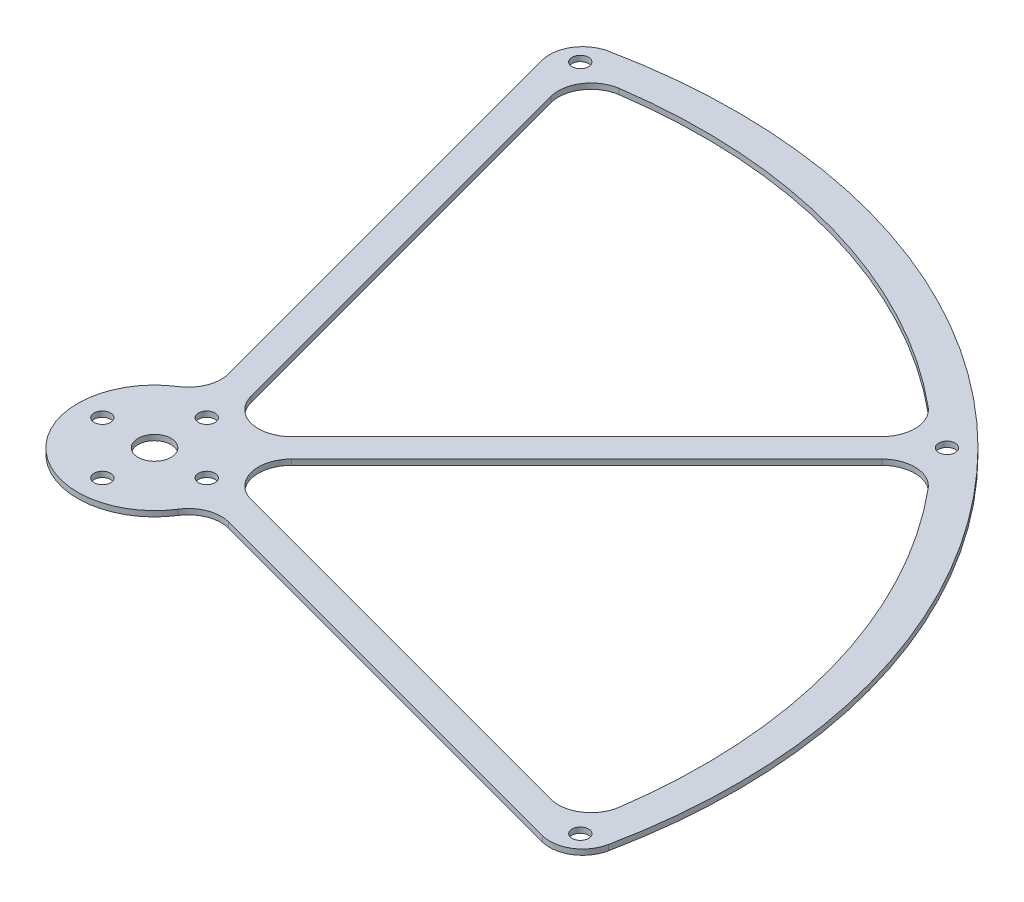
ISO-10303-21;
HEADER;
FILE_DESCRIPTION(('STEP AP214'),'2;1');
FILE_NAME('part.step','',(''),(''),'','','');
FILE_SCHEMA(('AUTOMOTIVE_DESIGN { 1 0 10303 214 1 1 1 1 }'));
ENDSEC;
DATA;
#1=APPLICATION_CONTEXT('core data for automotive mechanical design processes');
#2=APPLICATION_PROTOCOL_DEFINITION('international standard','automotive_design',2000,#1);
#3=PRODUCT_CONTEXT('',#1,'mechanical');
#4=PRODUCT('Part','Part','',(#3));
#5=PRODUCT_RELATED_PRODUCT_CATEGORY('part','',(#4));
#6=PRODUCT_DEFINITION_FORMATION('','',#4);
#7=PRODUCT_DEFINITION_CONTEXT('part definition',#1,'design');
#8=PRODUCT_DEFINITION('design','',#6,#7);
#9=PRODUCT_DEFINITION_SHAPE('','',#8);
#10=(LENGTH_UNIT() NAMED_UNIT(*) SI_UNIT(.MILLI.,.METRE.));
#11=(NAMED_UNIT(*) PLANE_ANGLE_UNIT() SI_UNIT($,.RADIAN.));
#12=(NAMED_UNIT(*) SI_UNIT($,.STERADIAN.) SOLID_ANGLE_UNIT());
#13=UNCERTAINTY_MEASURE_WITH_UNIT(LENGTH_MEASURE(1.E-05),#10,'distance_accuracy_value','');
#14=(GEOMETRIC_REPRESENTATION_CONTEXT(3) GLOBAL_UNCERTAINTY_ASSIGNED_CONTEXT((#13)) GLOBAL_UNIT_ASSIGNED_CONTEXT((#10,
#11,#12)) REPRESENTATION_CONTEXT('',''));
#15=CARTESIAN_POINT('',(0.,0.,0.));
#16=DIRECTION('',(0.,0.,1.));
#17=DIRECTION('',(1.,0.,0.));
#18=AXIS2_PLACEMENT_3D('',#15,#16,#17);
#19=CARTESIAN_POINT('',(-10.7335076216663,1.,-16.8757759565488));
#20=DIRECTION('',(0.,-1.,0.));
#21=DIRECTION('',(0.,0.,-1.));
#22=AXIS2_PLACEMENT_3D('',#19,#20,#21);
#23=PLANE('',#22);
#24=CARTESIAN_POINT('',(6.44116521906223,1.,-18.4619804992335));
#25=DIRECTION('',(0.,1.,0.));
#26=DIRECTION('',(0.,0.,-1.));
#27=AXIS2_PLACEMENT_3D('',#24,#25,#26);
#28=CIRCLE('',#27,6.);
#29=CARTESIAN_POINT('',(0.645610261327798,1.,-16.9090662286185));
#30=VERTEX_POINT('',#29);
#31=CARTESIAN_POINT('',(10.6838059061816,1.,-14.2193398121143));
#32=VERTEX_POINT('',#31);
#33=EDGE_CURVE('E260',#30,#32,#28,.T.);
#34=ORIENTED_EDGE('',*,*,#33,.F.);
#35=DIRECTION('',(0.258819045102518,0.,0.965925826289069));
#36=VECTOR('',#35,1.);
#37=CARTESIAN_POINT('',(0.645610261327798,1.,-16.9090662286185));
#38=LINE('',#37,#36);
#39=CARTESIAN_POINT('',(-19.3322065399041,1.,-91.46729355512));
#40=VERTEX_POINT('',#39);
#41=EDGE_CURVE('E277',#40,#30,#38,.T.);
#42=ORIENTED_EDGE('',*,*,#41,.F.);
#43=CARTESIAN_POINT('',(-13.5366515821697,1.,-93.0202078257351));
#44=DIRECTION('',(0.,1.,0.));
#45=DIRECTION('',(0.,0.,-1.));
#46=AXIS2_PLACEMENT_3D('',#43,#44,#45);
#47=CIRCLE('',#46,5.99999999999999);
#48=CARTESIAN_POINT('',(-14.4006931725209,1.,-98.9576678997181));
#49=VERTEX_POINT('',#48);
#50=EDGE_CURVE('E273',#49,#40,#47,.T.);
#51=ORIENTED_EDGE('',*,*,#50,.F.);
#52=CARTESIAN_POINT('',(0.,1.,0.));
#53=DIRECTION('',(0.,1.,0.));
#54=DIRECTION('',(0.,0.,1.));
#55=AXIS2_PLACEMENT_3D('',#52,#53,#54);
#56=CIRCLE('',#55,100.);
#57=CARTESIAN_POINT('',(64.0269413305991,1.,-76.8150426924832));
#58=VERTEX_POINT('',#57);
#59=EDGE_CURVE('E270',#58,#49,#56,.T.);
#60=ORIENTED_EDGE('',*,*,#59,.F.);
#61=CARTESIAN_POINT('',(60.1853248507631,1.,-72.2061401309342));
#62=DIRECTION('',(0.,1.,0.));
#63=DIRECTION('',(0.,0.,1.));
#64=AXIS2_PLACEMENT_3D('',#61,#62,#63);
#65=CIRCLE('',#64,6.00000000000001);
#66=CARTESIAN_POINT('',(64.4279655378824,1.,-67.9634994438149));
#67=VERTEX_POINT('',#66);
#68=EDGE_CURVE('E267',#67,#58,#65,.T.);
#69=ORIENTED_EDGE('',*,*,#68,.F.);
#70=DIRECTION('',(0.707106781186549,0.,-0.707106781186546));
#71=VECTOR('',#70,1.);
#72=CARTESIAN_POINT('',(64.4279655378824,1.,-67.9634994438149));
#73=LINE('',#72,#71);
#74=EDGE_CURVE('E263',#32,#67,#73,.T.);
#75=ORIENTED_EDGE('',*,*,#74,.F.);
#76=EDGE_LOOP('',(#34,#42,#51,#60,#69,#75));
#77=FACE_BOUND('',#76,.T.);
#78=CARTESIAN_POINT('',(-10.7335076216663,1.,-16.8757759565488));
#79=DIRECTION('',(0.,-1.,0.));
#80=DIRECTION('',(0.,0.,-1.));
#81=AXIS2_PLACEMENT_3D('',#78,#79,#80);
#82=CIRCLE('',#81,6.);
#83=CARTESIAN_POINT('',(-4.93795266393184,1.,-18.428690227164));
#84=VERTEX_POINT('',#83);
#85=CARTESIAN_POINT('',(-7.51345533516638,1.,-11.8130431695842));
#86=VERTEX_POINT('',#85);
#87=EDGE_CURVE('E363',#84,#86,#82,.T.);
#88=ORIENTED_EDGE('',*,*,#87,.T.);
#89=CARTESIAN_POINT('',(0.,1.,0.));
#90=DIRECTION('',(0.,1.,0.));
#91=DIRECTION('',(0.,0.,1.));
#92=AXIS2_PLACEMENT_3D('',#89,#90,#91);
#93=CIRCLE('',#92,14.);
#94=CARTESIAN_POINT('',(11.8130431695842,1.,7.51345533516642));
#95=VERTEX_POINT('',#94);
#96=EDGE_CURVE('E367',#86,#95,#93,.T.);
#97=ORIENTED_EDGE('',*,*,#96,.T.);
#98=CARTESIAN_POINT('',(16.8757759565488,1.,10.7335076216663));
#99=DIRECTION('',(0.,-1.,0.));
#100=DIRECTION('',(0.,0.,1.));
#101=AXIS2_PLACEMENT_3D('',#98,#99,#100);
#102=CIRCLE('',#101,6.);
#103=CARTESIAN_POINT('',(18.4286902271639,1.,4.93795266393191));
#104=VERTEX_POINT('',#103);
#105=EDGE_CURVE('E371',#95,#104,#102,.T.);
#106=ORIENTED_EDGE('',*,*,#105,.T.);
#107=DIRECTION('',(0.965925826289068,0.,0.258819045102521));
#108=VECTOR('',#107,1.);
#109=CARTESIAN_POINT('',(18.4286902271639,1.,4.93795266393191));
#110=LINE('',#109,#108);
#111=CARTESIAN_POINT('',(96.4185592178916,1.,25.8352750778065));
#112=VERTEX_POINT('',#111);
#113=EDGE_CURVE('E374',#104,#112,#110,.T.);
#114=ORIENTED_EDGE('',*,*,#113,.T.);
#115=CARTESIAN_POINT('',(97.9714734885067,1.,20.0397201200721));
#116=DIRECTION('',(0.,1.,0.));
#117=DIRECTION('',(0.,0.,-1.));
#118=AXIS2_PLACEMENT_3D('',#115,#116,#117);
#119=CIRCLE('',#118,6.);
#120=CARTESIAN_POINT('',(103.849761897817,1.,21.2421033272764));
#121=VERTEX_POINT('',#120);
#122=EDGE_CURVE('E377',#112,#121,#119,.T.);
#123=ORIENTED_EDGE('',*,*,#122,.T.);
#124=CARTESIAN_POINT('',(0.,1.,0.));
#125=DIRECTION('',(0.,1.,0.));
#126=DIRECTION('',(0.,0.,-1.));
#127=AXIS2_PLACEMENT_3D('',#124,#125,#126);
#128=CIRCLE('',#127,106.);
#129=CARTESIAN_POINT('',(-21.2421033272761,1.,-103.849761897817));
#130=VERTEX_POINT('',#129);
#131=EDGE_CURVE('E380',#121,#130,#128,.T.);
#132=ORIENTED_EDGE('',*,*,#131,.T.);
#133=CARTESIAN_POINT('',(-20.0397201200717,1.,-97.9714734885068));
#134=DIRECTION('',(0.,1.,0.));
#135=DIRECTION('',(0.,0.,1.));
#136=AXIS2_PLACEMENT_3D('',#133,#134,#135);
#137=CIRCLE('',#136,6.00000000000001);
#138=CARTESIAN_POINT('',(-25.8352750778062,1.,-96.4185592178917));
#139=VERTEX_POINT('',#138);
#140=EDGE_CURVE('E383',#130,#139,#137,.T.);
#141=ORIENTED_EDGE('',*,*,#140,.T.);
#142=DIRECTION('',(0.258819045102518,0.,0.965925826289069));
#143=VECTOR('',#142,1.);
#144=CARTESIAN_POINT('',(-25.8352750778062,1.,-96.4185592178917));
#145=LINE('',#144,#143);
#146=EDGE_CURVE('E386',#139,#84,#145,.T.);
#147=ORIENTED_EDGE('',*,*,#146,.T.);
#148=EDGE_LOOP('',(#88,#97,#106,#114,#123,#132,#141,#147));
#149=FACE_BOUND('',#148,.T.);
#150=CARTESIAN_POINT('',(0.,1.,-9.5));
#151=DIRECTION('',(0.,1.,0.));
#152=DIRECTION('',(0.,0.,1.));
#153=AXIS2_PLACEMENT_3D('',#150,#151,#152);
#154=CIRCLE('',#153,1.5);
#155=CARTESIAN_POINT('',(0.,1.,-8.));
#156=VERTEX_POINT('',#155);
#157=EDGE_CURVE('E355',#156,#156,#154,.T.);
#158=ORIENTED_EDGE('',*,*,#157,.F.);
#159=EDGE_LOOP('',(#158));
#160=FACE_BOUND('',#159,.T.);
#161=CARTESIAN_POINT('',(9.5,1.,0.));
#162=DIRECTION('',(0.,1.,0.));
#163=DIRECTION('',(0.,0.,1.));
#164=AXIS2_PLACEMENT_3D('',#161,#162,#163);
#165=CIRCLE('',#164,1.5);
#166=CARTESIAN_POINT('',(9.5,1.,1.5));
#167=VERTEX_POINT('',#166);
#168=EDGE_CURVE('E347',#167,#167,#165,.T.);
#169=ORIENTED_EDGE('',*,*,#168,.F.);
#170=EDGE_LOOP('',(#169));
#171=FACE_BOUND('',#170,.T.);
#172=CARTESIAN_POINT('',(0.,1.,9.5));
#173=DIRECTION('',(0.,1.,0.));
#174=DIRECTION('',(0.,0.,1.));
#175=AXIS2_PLACEMENT_3D('',#172,#173,#174);
#176=CIRCLE('',#175,1.5);
#177=CARTESIAN_POINT('',(0.,1.,11.));
#178=VERTEX_POINT('',#177);
#179=EDGE_CURVE('E339',#178,#178,#176,.T.);
#180=ORIENTED_EDGE('',*,*,#179,.F.);
#181=EDGE_LOOP('',(#180));
#182=FACE_BOUND('',#181,.T.);
#183=CARTESIAN_POINT('',(-9.5,1.,0.));
#184=DIRECTION('',(0.,1.,0.));
#185=DIRECTION('',(0.,0.,1.));
#186=AXIS2_PLACEMENT_3D('',#183,#184,#185);
#187=CIRCLE('',#186,1.5);
#188=CARTESIAN_POINT('',(-9.5,1.,1.5));
#189=VERTEX_POINT('',#188);
#190=EDGE_CURVE('E331',#189,#189,#187,.T.);
#191=ORIENTED_EDGE('',*,*,#190,.F.);
#192=EDGE_LOOP('',(#191));
#193=FACE_BOUND('',#192,.T.);
#194=CARTESIAN_POINT('',(0.,1.,0.));
#195=DIRECTION('',(0.,1.,0.));
#196=DIRECTION('',(0.,0.,1.));
#197=AXIS2_PLACEMENT_3D('',#194,#195,#196);
#198=CIRCLE('',#197,3.);
#199=CARTESIAN_POINT('',(0.,1.,3.));
#200=VERTEX_POINT('',#199);
#201=EDGE_CURVE('E323',#200,#200,#198,.T.);
#202=ORIENTED_EDGE('',*,*,#201,.F.);
#203=EDGE_LOOP('',(#202));
#204=FACE_BOUND('',#203,.T.);
#205=CARTESIAN_POINT('',(18.4619804992336,1.,-6.44116521906218));
#206=DIRECTION('',(0.,1.,0.));
#207=DIRECTION('',(0.,0.,1.));
#208=AXIS2_PLACEMENT_3D('',#205,#206,#207);
#209=CIRCLE('',#208,6.);
#210=CARTESIAN_POINT('',(14.2193398121143,1.,-10.6838059061815));
#211=VERTEX_POINT('',#210);
#212=CARTESIAN_POINT('',(16.9090662286185,1.,-0.645610261327742));
#213=VERTEX_POINT('',#212);
#214=EDGE_CURVE('E185',#211,#213,#209,.T.);
#215=ORIENTED_EDGE('',*,*,#214,.F.);
#216=DIRECTION('',(-0.707106781186548,0.,0.707106781186547));
#217=VECTOR('',#216,1.);
#218=CARTESIAN_POINT('',(67.9634994438151,1.,-64.4279655378822));
#219=LINE('',#218,#217);
#220=CARTESIAN_POINT('',(67.9634994438151,1.,-64.4279655378822));
#221=VERTEX_POINT('',#220);
#222=EDGE_CURVE('E225',#221,#211,#219,.T.);
#223=ORIENTED_EDGE('',*,*,#222,.F.);
#224=CARTESIAN_POINT('',(72.2061401309344,1.,-60.1853248507629));
#225=DIRECTION('',(0.,1.,0.));
#226=DIRECTION('',(0.,0.,-1.));
#227=AXIS2_PLACEMENT_3D('',#224,#225,#226);
#228=CIRCLE('',#227,6.00000000000002);
#229=CARTESIAN_POINT('',(76.8150426924834,1.,-64.0269413305988));
#230=VERTEX_POINT('',#229);
#231=EDGE_CURVE('E222',#230,#221,#228,.T.);
#232=ORIENTED_EDGE('',*,*,#231,.F.);
#233=CARTESIAN_POINT('',(0.,1.,0.));
#234=DIRECTION('',(0.,1.,0.));
#235=DIRECTION('',(0.,0.,-1.));
#236=AXIS2_PLACEMENT_3D('',#233,#234,#235);
#237=CIRCLE('',#236,100.);
#238=CARTESIAN_POINT('',(98.9576678997181,1.,14.4006931725213));
#239=VERTEX_POINT('',#238);
#240=EDGE_CURVE('E216',#239,#230,#237,.T.);
#241=ORIENTED_EDGE('',*,*,#240,.F.);
#242=CARTESIAN_POINT('',(93.020207825735,1.,13.53665158217));
#243=DIRECTION('',(0.,1.,0.));
#244=DIRECTION('',(0.,0.,-1.));
#245=AXIS2_PLACEMENT_3D('',#242,#243,#244);
#246=CIRCLE('',#245,6.);
#247=CARTESIAN_POINT('',(91.4672935551199,1.,19.3322065399044));
#248=VERTEX_POINT('',#247);
#249=EDGE_CURVE('E209',#248,#239,#246,.T.);
#250=ORIENTED_EDGE('',*,*,#249,.F.);
#251=DIRECTION('',(0.965925826289068,0.,0.258819045102521));
#252=VECTOR('',#251,1.);
#253=CARTESIAN_POINT('',(16.9090662286185,1.,-0.645610261327742));
#254=LINE('',#253,#252);
#255=EDGE_CURVE('E194',#213,#248,#254,.T.);
#256=ORIENTED_EDGE('',*,*,#255,.F.);
#257=EDGE_LOOP('',(#215,#223,#232,#241,#250,#256));
#258=FACE_BOUND('',#257,.T.);
#259=CARTESIAN_POINT('',(72.124891681028,1.,-72.1248916810277));
#260=DIRECTION('',(0.,1.,0.));
#261=DIRECTION('',(0.,0.,1.));
#262=AXIS2_PLACEMENT_3D('',#259,#260,#261);
#263=CIRCLE('',#262,1.5);
#264=CARTESIAN_POINT('',(72.124891681028,1.,-70.6248916810277));
#265=VERTEX_POINT('',#264);
#266=EDGE_CURVE('E230',#265,#265,#263,.T.);
#267=ORIENTED_EDGE('',*,*,#266,.F.);
#268=EDGE_LOOP('',(#267));
#269=FACE_BOUND('',#268,.T.);
#270=CARTESIAN_POINT('',(-22.0768406216924,1.,-99.5821927262321));
#271=DIRECTION('',(0.,1.,0.));
#272=DIRECTION('',(0.,0.,-1.));
#273=AXIS2_PLACEMENT_3D('',#270,#271,#272);
#274=CIRCLE('',#273,1.49999999999706);
#275=CARTESIAN_POINT('',(-22.0768406216924,1.,-101.082192726229));
#276=VERTEX_POINT('',#275);
#277=EDGE_CURVE('E607',#276,#276,#274,.T.);
#278=ORIENTED_EDGE('',*,*,#277,.F.);
#279=EDGE_LOOP('',(#278));
#280=FACE_BOUND('',#279,.T.);
#281=CARTESIAN_POINT('',(99.582192726232,1.,22.0768406216927));
#282=DIRECTION('',(0.,1.,0.));
#283=DIRECTION('',(0.,0.,1.));
#284=AXIS2_PLACEMENT_3D('',#281,#282,#283);
#285=CIRCLE('',#284,1.49999999999707);
#286=CARTESIAN_POINT('',(99.582192726232,1.,23.5768406216898));
#287=VERTEX_POINT('',#286);
#288=EDGE_CURVE('E595',#287,#287,#285,.T.);
#289=ORIENTED_EDGE('',*,*,#288,.F.);
#290=EDGE_LOOP('',(#289));
#291=FACE_BOUND('',#290,.T.);
#292=ADVANCED_FACE('F47',(#77,#149,#160,#171,#182,#193,#204,#258,#269,#280,#291),#23,.F.);
#293=CARTESIAN_POINT('',(-10.7335076216663,0.,-16.8757759565488));
#294=DIRECTION('',(0.,-1.,0.));
#295=DIRECTION('',(0.,0.,-1.));
#296=AXIS2_PLACEMENT_3D('',#293,#294,#295);
#297=PLANE('',#296);
#298=CARTESIAN_POINT('',(-22.0768406216924,0.,-99.5821927262321));
#299=DIRECTION('',(0.,1.,0.));
#300=DIRECTION('',(0.,0.,-1.));
#301=AXIS2_PLACEMENT_3D('',#298,#299,#300);
#302=CIRCLE('',#301,1.49999999999706);
#303=CARTESIAN_POINT('',(-22.0768406216924,0.,-101.082192726229));
#304=VERTEX_POINT('',#303);
#305=EDGE_CURVE('E604',#304,#304,#302,.T.);
#306=ORIENTED_EDGE('',*,*,#305,.T.);
#307=EDGE_LOOP('',(#306));
#308=FACE_BOUND('',#307,.T.);
#309=DIRECTION('',(-0.707106781186548,0.,0.707106781186547));
#310=VECTOR('',#309,1.);
#311=CARTESIAN_POINT('',(67.9634994438151,0.,-64.4279655378822));
#312=LINE('',#311,#310);
#313=CARTESIAN_POINT('',(67.9634994438151,0.,-64.4279655378822));
#314=VERTEX_POINT('',#313);
#315=CARTESIAN_POINT('',(14.2193398121144,0.,-10.6838059061815));
#316=VERTEX_POINT('',#315);
#317=EDGE_CURVE('E195',#314,#316,#312,.T.);
#318=ORIENTED_EDGE('',*,*,#317,.T.);
#319=CARTESIAN_POINT('',(18.4619804992336,0.,-6.44116521906218));
#320=DIRECTION('',(0.,1.,0.));
#321=DIRECTION('',(0.,0.,1.));
#322=AXIS2_PLACEMENT_3D('',#319,#320,#321);
#323=CIRCLE('',#322,6.);
#324=CARTESIAN_POINT('',(16.9090662286185,0.,-0.645610261327742));
#325=VERTEX_POINT('',#324);
#326=EDGE_CURVE('E71',#316,#325,#323,.T.);
#327=ORIENTED_EDGE('',*,*,#326,.T.);
#328=DIRECTION('',(0.965925826289068,0.,0.258819045102521));
#329=VECTOR('',#328,1.);
#330=CARTESIAN_POINT('',(16.9090662286185,0.,-0.645610261327742));
#331=LINE('',#330,#329);
#332=CARTESIAN_POINT('',(91.4672935551199,0.,19.3322065399044));
#333=VERTEX_POINT('',#332);
#334=EDGE_CURVE('E201',#325,#333,#331,.T.);
#335=ORIENTED_EDGE('',*,*,#334,.T.);
#336=CARTESIAN_POINT('',(93.020207825735,0.,13.53665158217));
#337=DIRECTION('',(0.,1.,0.));
#338=DIRECTION('',(0.,0.,-1.));
#339=AXIS2_PLACEMENT_3D('',#336,#337,#338);
#340=CIRCLE('',#339,6.);
#341=CARTESIAN_POINT('',(98.9576678997181,0.,14.4006931725213));
#342=VERTEX_POINT('',#341);
#343=EDGE_CURVE('E233',#333,#342,#340,.T.);
#344=ORIENTED_EDGE('',*,*,#343,.T.);
#345=CARTESIAN_POINT('',(0.,0.,0.));
#346=DIRECTION('',(0.,1.,0.));
#347=DIRECTION('',(0.,0.,-1.));
#348=AXIS2_PLACEMENT_3D('',#345,#346,#347);
#349=CIRCLE('',#348,100.);
#350=CARTESIAN_POINT('',(76.8150426924834,0.,-64.0269413305988));
#351=VERTEX_POINT('',#350);
#352=EDGE_CURVE('E237',#342,#351,#349,.T.);
#353=ORIENTED_EDGE('',*,*,#352,.T.);
#354=CARTESIAN_POINT('',(72.2061401309344,0.,-60.1853248507629));
#355=DIRECTION('',(0.,1.,0.));
#356=DIRECTION('',(0.,0.,-1.));
#357=AXIS2_PLACEMENT_3D('',#354,#355,#356);
#358=CIRCLE('',#357,6.00000000000002);
#359=EDGE_CURVE('E241',#351,#314,#358,.T.);
#360=ORIENTED_EDGE('',*,*,#359,.T.);
#361=EDGE_LOOP('',(#318,#327,#335,#344,#353,#360));
#362=FACE_BOUND('',#361,.T.);
#363=DIRECTION('',(0.258819045102518,0.,0.965925826289069));
#364=VECTOR('',#363,1.);
#365=CARTESIAN_POINT('',(0.645610261327798,0.,-16.9090662286185));
#366=LINE('',#365,#364);
#367=CARTESIAN_POINT('',(-19.3322065399041,0.,-91.46729355512));
#368=VERTEX_POINT('',#367);
#369=CARTESIAN_POINT('',(0.645610261327797,0.,-16.9090662286185));
#370=VERTEX_POINT('',#369);
#371=EDGE_CURVE('E264',#368,#370,#366,.T.);
#372=ORIENTED_EDGE('',*,*,#371,.T.);
#373=CARTESIAN_POINT('',(6.44116521906223,0.,-18.4619804992335));
#374=DIRECTION('',(0.,1.,0.));
#375=DIRECTION('',(0.,0.,-1.));
#376=AXIS2_PLACEMENT_3D('',#373,#374,#375);
#377=CIRCLE('',#376,6.);
#378=CARTESIAN_POINT('',(10.6838059061816,0.,-14.2193398121143));
#379=VERTEX_POINT('',#378);
#380=EDGE_CURVE('E203',#370,#379,#377,.T.);
#381=ORIENTED_EDGE('',*,*,#380,.T.);
#382=DIRECTION('',(0.707106781186549,0.,-0.707106781186546));
#383=VECTOR('',#382,1.);
#384=CARTESIAN_POINT('',(64.4279655378824,0.,-67.9634994438149));
#385=LINE('',#384,#383);
#386=CARTESIAN_POINT('',(64.4279655378824,0.,-67.9634994438149));
#387=VERTEX_POINT('',#386);
#388=EDGE_CURVE('E284',#379,#387,#385,.T.);
#389=ORIENTED_EDGE('',*,*,#388,.T.);
#390=CARTESIAN_POINT('',(60.1853248507631,0.,-72.2061401309342));
#391=DIRECTION('',(0.,1.,0.));
#392=DIRECTION('',(0.,0.,1.));
#393=AXIS2_PLACEMENT_3D('',#390,#391,#392);
#394=CIRCLE('',#393,6.00000000000001);
#395=CARTESIAN_POINT('',(64.0269413305991,0.,-76.8150426924832));
#396=VERTEX_POINT('',#395);
#397=EDGE_CURVE('E288',#387,#396,#394,.T.);
#398=ORIENTED_EDGE('',*,*,#397,.T.);
#399=CARTESIAN_POINT('',(0.,0.,0.));
#400=DIRECTION('',(0.,1.,0.));
#401=DIRECTION('',(0.,0.,1.));
#402=AXIS2_PLACEMENT_3D('',#399,#400,#401);
#403=CIRCLE('',#402,100.);
#404=CARTESIAN_POINT('',(-14.4006931725209,0.,-98.9576678997181));
#405=VERTEX_POINT('',#404);
#406=EDGE_CURVE('E292',#396,#405,#403,.T.);
#407=ORIENTED_EDGE('',*,*,#406,.T.);
#408=CARTESIAN_POINT('',(-13.5366515821697,0.,-93.0202078257351));
#409=DIRECTION('',(0.,1.,0.));
#410=DIRECTION('',(0.,0.,-1.));
#411=AXIS2_PLACEMENT_3D('',#408,#409,#410);
#412=CIRCLE('',#411,5.99999999999999);
#413=EDGE_CURVE('E296',#405,#368,#412,.T.);
#414=ORIENTED_EDGE('',*,*,#413,.T.);
#415=EDGE_LOOP('',(#372,#381,#389,#398,#407,#414));
#416=FACE_BOUND('',#415,.T.);
#417=CARTESIAN_POINT('',(0.,0.,0.));
#418=DIRECTION('',(0.,1.,0.));
#419=DIRECTION('',(0.,0.,1.));
#420=AXIS2_PLACEMENT_3D('',#417,#418,#419);
#421=CIRCLE('',#420,3.);
#422=CARTESIAN_POINT('',(0.,0.,3.));
#423=VERTEX_POINT('',#422);
#424=EDGE_CURVE('E322',#423,#423,#421,.T.);
#425=ORIENTED_EDGE('',*,*,#424,.T.);
#426=EDGE_LOOP('',(#425));
#427=FACE_BOUND('',#426,.T.);
#428=CARTESIAN_POINT('',(0.,0.,9.5));
#429=DIRECTION('',(0.,1.,0.));
#430=DIRECTION('',(0.,0.,1.));
#431=AXIS2_PLACEMENT_3D('',#428,#429,#430);
#432=CIRCLE('',#431,1.5);
#433=CARTESIAN_POINT('',(0.,0.,11.));
#434=VERTEX_POINT('',#433);
#435=EDGE_CURVE('E335',#434,#434,#432,.T.);
#436=ORIENTED_EDGE('',*,*,#435,.T.);
#437=EDGE_LOOP('',(#436));
#438=FACE_BOUND('',#437,.T.);
#439=CARTESIAN_POINT('',(0.,0.,-9.5));
#440=DIRECTION('',(0.,1.,0.));
#441=DIRECTION('',(0.,0.,1.));
#442=AXIS2_PLACEMENT_3D('',#439,#440,#441);
#443=CIRCLE('',#442,1.5);
#444=CARTESIAN_POINT('',(0.,0.,-8.));
#445=VERTEX_POINT('',#444);
#446=EDGE_CURVE('E351',#445,#445,#443,.T.);
#447=ORIENTED_EDGE('',*,*,#446,.T.);
#448=EDGE_LOOP('',(#447));
#449=FACE_BOUND('',#448,.T.);
#450=CARTESIAN_POINT('',(-10.7335076216663,0.,-16.8757759565488));
#451=DIRECTION('',(0.,-1.,0.));
#452=DIRECTION('',(0.,0.,-1.));
#453=AXIS2_PLACEMENT_3D('',#450,#451,#452);
#454=CIRCLE('',#453,6.);
#455=CARTESIAN_POINT('',(-4.93795266393184,0.,-18.428690227164));
#456=VERTEX_POINT('',#455);
#457=CARTESIAN_POINT('',(-7.51345533516638,0.,-11.8130431695842));
#458=VERTEX_POINT('',#457);
#459=EDGE_CURVE('E359',#456,#458,#454,.T.);
#460=ORIENTED_EDGE('',*,*,#459,.F.);
#461=DIRECTION('',(0.258819045102518,0.,0.965925826289069));
#462=VECTOR('',#461,1.);
#463=CARTESIAN_POINT('',(-25.8352750778062,0.,-96.4185592178917));
#464=LINE('',#463,#462);
#465=CARTESIAN_POINT('',(-25.8352750778062,0.,-96.4185592178917));
#466=VERTEX_POINT('',#465);
#467=EDGE_CURVE('E368',#466,#456,#464,.T.);
#468=ORIENTED_EDGE('',*,*,#467,.F.);
#469=CARTESIAN_POINT('',(-20.0397201200717,0.,-97.9714734885068));
#470=DIRECTION('',(0.,1.,0.));
#471=DIRECTION('',(0.,0.,1.));
#472=AXIS2_PLACEMENT_3D('',#469,#470,#471);
#473=CIRCLE('',#472,6.00000000000001);
#474=CARTESIAN_POINT('',(-21.2421033272761,0.,-103.849761897817));
#475=VERTEX_POINT('',#474);
#476=EDGE_CURVE('E408',#475,#466,#473,.T.);
#477=ORIENTED_EDGE('',*,*,#476,.F.);
#478=CARTESIAN_POINT('',(0.,0.,0.));
#479=DIRECTION('',(0.,1.,0.));
#480=DIRECTION('',(0.,0.,-1.));
#481=AXIS2_PLACEMENT_3D('',#478,#479,#480);
#482=CIRCLE('',#481,106.);
#483=CARTESIAN_POINT('',(103.849761897817,0.,21.2421033272764));
#484=VERTEX_POINT('',#483);
#485=EDGE_CURVE('E405',#484,#475,#482,.T.);
#486=ORIENTED_EDGE('',*,*,#485,.F.);
#487=CARTESIAN_POINT('',(97.9714734885067,0.,20.0397201200721));
#488=DIRECTION('',(0.,1.,0.));
#489=DIRECTION('',(0.,0.,-1.));
#490=AXIS2_PLACEMENT_3D('',#487,#488,#489);
#491=CIRCLE('',#490,6.);
#492=CARTESIAN_POINT('',(96.4185592178916,0.,25.8352750778065));
#493=VERTEX_POINT('',#492);
#494=EDGE_CURVE('E402',#493,#484,#491,.T.);
#495=ORIENTED_EDGE('',*,*,#494,.F.);
#496=DIRECTION('',(0.965925826289068,0.,0.258819045102521));
#497=VECTOR('',#496,1.);
#498=CARTESIAN_POINT('',(18.4286902271639,0.,4.93795266393191));
#499=LINE('',#498,#497);
#500=CARTESIAN_POINT('',(18.4286902271639,0.,4.93795266393191));
#501=VERTEX_POINT('',#500);
#502=EDGE_CURVE('E399',#501,#493,#499,.T.);
#503=ORIENTED_EDGE('',*,*,#502,.F.);
#504=CARTESIAN_POINT('',(16.8757759565488,0.,10.7335076216663));
#505=DIRECTION('',(0.,-1.,0.));
#506=DIRECTION('',(0.,0.,1.));
#507=AXIS2_PLACEMENT_3D('',#504,#505,#506);
#508=CIRCLE('',#507,6.);
#509=CARTESIAN_POINT('',(11.8130431695842,0.,7.51345533516642));
#510=VERTEX_POINT('',#509);
#511=EDGE_CURVE('E396',#510,#501,#508,.T.);
#512=ORIENTED_EDGE('',*,*,#511,.F.);
#513=CARTESIAN_POINT('',(0.,0.,0.));
#514=DIRECTION('',(0.,1.,0.));
#515=DIRECTION('',(0.,0.,1.));
#516=AXIS2_PLACEMENT_3D('',#513,#514,#515);
#517=CIRCLE('',#516,14.);
#518=EDGE_CURVE('E393',#458,#510,#517,.T.);
#519=ORIENTED_EDGE('',*,*,#518,.F.);
#520=EDGE_LOOP('',(#460,#468,#477,#486,#495,#503,#512,#519));
#521=FACE_BOUND('',#520,.T.);
#522=CARTESIAN_POINT('',(9.5,0.,0.));
#523=DIRECTION('',(0.,1.,0.));
#524=DIRECTION('',(0.,0.,1.));
#525=AXIS2_PLACEMENT_3D('',#522,#523,#524);
#526=CIRCLE('',#525,1.5);
#527=CARTESIAN_POINT('',(9.5,0.,1.5));
#528=VERTEX_POINT('',#527);
#529=EDGE_CURVE('E343',#528,#528,#526,.T.);
#530=ORIENTED_EDGE('',*,*,#529,.T.);
#531=EDGE_LOOP('',(#530));
#532=FACE_BOUND('',#531,.T.);
#533=CARTESIAN_POINT('',(-9.5,0.,0.));
#534=DIRECTION('',(0.,1.,0.));
#535=DIRECTION('',(0.,0.,1.));
#536=AXIS2_PLACEMENT_3D('',#533,#534,#535);
#537=CIRCLE('',#536,1.5);
#538=CARTESIAN_POINT('',(-9.5,0.,1.5));
#539=VERTEX_POINT('',#538);
#540=EDGE_CURVE('E327',#539,#539,#537,.T.);
#541=ORIENTED_EDGE('',*,*,#540,.T.);
#542=EDGE_LOOP('',(#541));
#543=FACE_BOUND('',#542,.T.);
#544=CARTESIAN_POINT('',(72.124891681028,0.,-72.1248916810277));
#545=DIRECTION('',(0.,1.,0.));
#546=DIRECTION('',(0.,0.,1.));
#547=AXIS2_PLACEMENT_3D('',#544,#545,#546);
#548=CIRCLE('',#547,1.5);
#549=CARTESIAN_POINT('',(72.124891681028,0.,-70.6248916810277));
#550=VERTEX_POINT('',#549);
#551=EDGE_CURVE('E611',#550,#550,#548,.T.);
#552=ORIENTED_EDGE('',*,*,#551,.T.);
#553=EDGE_LOOP('',(#552));
#554=FACE_BOUND('',#553,.T.);
#555=CARTESIAN_POINT('',(99.582192726232,0.,22.0768406216927));
#556=DIRECTION('',(0.,1.,0.));
#557=DIRECTION('',(0.,0.,1.));
#558=AXIS2_PLACEMENT_3D('',#555,#556,#557);
#559=CIRCLE('',#558,1.49999999999707);
#560=CARTESIAN_POINT('',(99.582192726232,0.,23.5768406216898));
#561=VERTEX_POINT('',#560);
#562=EDGE_CURVE('E598',#561,#561,#559,.T.);
#563=ORIENTED_EDGE('',*,*,#562,.T.);
#564=EDGE_LOOP('',(#563));
#565=FACE_BOUND('',#564,.T.);
#566=ADVANCED_FACE('F446',(#308,#362,#416,#427,#438,#449,#521,#532,#543,#554,#565),#297,.T.);
#567=CARTESIAN_POINT('',(-10.7335076216663,1.,-16.8757759565488));
#568=DIRECTION('',(0.,-1.,0.));
#569=DIRECTION('',(0.,0.,-1.));
#570=AXIS2_PLACEMENT_3D('',#567,#568,#569);
#571=CYLINDRICAL_SURFACE('',#570,6.);
#572=ORIENTED_EDGE('',*,*,#459,.T.);
#573=DIRECTION('',(0.,-1.,0.));
#574=VECTOR('',#573,1.);
#575=CARTESIAN_POINT('',(-7.51345533516638,1.,-11.8130431695842));
#576=LINE('',#575,#574);
#577=EDGE_CURVE('E11',#86,#458,#576,.T.);
#578=ORIENTED_EDGE('',*,*,#577,.F.);
#579=ORIENTED_EDGE('',*,*,#87,.F.);
#580=DIRECTION('',(0.,-1.,0.));
#581=VECTOR('',#580,1.);
#582=CARTESIAN_POINT('',(-4.93795266393184,1.,-18.428690227164));
#583=LINE('',#582,#581);
#584=EDGE_CURVE('E389',#84,#456,#583,.T.);
#585=ORIENTED_EDGE('',*,*,#584,.T.);
#586=EDGE_LOOP('',(#572,#578,#579,#585));
#587=FACE_BOUND('',#586,.T.);
#588=ADVANCED_FACE('F49',(#587),#571,.F.);
#589=CARTESIAN_POINT('',(0.,1.,0.));
#590=DIRECTION('',(0.,-1.,0.));
#591=DIRECTION('',(0.,0.,-1.));
#592=AXIS2_PLACEMENT_3D('',#589,#590,#591);
#593=CYLINDRICAL_SURFACE('',#592,14.);
#594=ORIENTED_EDGE('',*,*,#518,.T.);
#595=DIRECTION('',(0.,-1.,0.));
#596=VECTOR('',#595,1.);
#597=CARTESIAN_POINT('',(11.8130431695842,1.,7.51345533516642));
#598=LINE('',#597,#596);
#599=EDGE_CURVE('E56',#95,#510,#598,.T.);
#600=ORIENTED_EDGE('',*,*,#599,.F.);
#601=ORIENTED_EDGE('',*,*,#96,.F.);
#602=ORIENTED_EDGE('',*,*,#577,.T.);
#603=EDGE_LOOP('',(#594,#600,#601,#602));
#604=FACE_BOUND('',#603,.T.);
#605=ADVANCED_FACE('F464',(#604),#593,.T.);
#606=CARTESIAN_POINT('',(16.8757759565488,1.,10.7335076216663));
#607=DIRECTION('',(0.,-1.,0.));
#608=DIRECTION('',(0.,0.,-1.));
#609=AXIS2_PLACEMENT_3D('',#606,#607,#608);
#610=CYLINDRICAL_SURFACE('',#609,6.);
#611=ORIENTED_EDGE('',*,*,#511,.T.);
#612=DIRECTION('',(0.,-1.,0.));
#613=VECTOR('',#612,1.);
#614=CARTESIAN_POINT('',(18.4286902271639,1.,4.93795266393191));
#615=LINE('',#614,#613);
#616=EDGE_CURVE('E431',#104,#501,#615,.T.);
#617=ORIENTED_EDGE('',*,*,#616,.F.);
#618=ORIENTED_EDGE('',*,*,#105,.F.);
#619=ORIENTED_EDGE('',*,*,#599,.T.);
#620=EDGE_LOOP('',(#611,#617,#618,#619));
#621=FACE_BOUND('',#620,.T.);
#622=ADVANCED_FACE('F440',(#621),#610,.F.);
#623=CARTESIAN_POINT('',(18.4286902271639,1.,4.93795266393191));
#624=DIRECTION('',(0.258819045102521,0.,-0.965925826289068));
#625=DIRECTION('',(-0.965925826289068,0.,-0.258819045102521));
#626=AXIS2_PLACEMENT_3D('',#623,#624,#625);
#627=PLANE('',#626);
#628=ORIENTED_EDGE('',*,*,#502,.T.);
#629=DIRECTION('',(0.,-1.,0.));
#630=VECTOR('',#629,1.);
#631=CARTESIAN_POINT('',(96.4185592178916,1.,25.8352750778065));
#632=LINE('',#631,#630);
#633=EDGE_CURVE('E428',#112,#493,#632,.T.);
#634=ORIENTED_EDGE('',*,*,#633,.F.);
#635=ORIENTED_EDGE('',*,*,#113,.F.);
#636=ORIENTED_EDGE('',*,*,#616,.T.);
#637=EDGE_LOOP('',(#628,#634,#635,#636));
#638=FACE_BOUND('',#637,.T.);
#639=ADVANCED_FACE('F452',(#638),#627,.F.);
#640=CARTESIAN_POINT('',(97.9714734885067,1.,20.0397201200721));
#641=DIRECTION('',(0.,-1.,0.));
#642=DIRECTION('',(0.,0.,-1.));
#643=AXIS2_PLACEMENT_3D('',#640,#641,#642);
#644=CYLINDRICAL_SURFACE('',#643,6.);
#645=ORIENTED_EDGE('',*,*,#494,.T.);
#646=DIRECTION('',(0.,-1.,0.));
#647=VECTOR('',#646,1.);
#648=CARTESIAN_POINT('',(103.849761897817,1.,21.2421033272764));
#649=LINE('',#648,#647);
#650=EDGE_CURVE('E424',#121,#484,#649,.T.);
#651=ORIENTED_EDGE('',*,*,#650,.F.);
#652=ORIENTED_EDGE('',*,*,#122,.F.);
#653=ORIENTED_EDGE('',*,*,#633,.T.);
#654=EDGE_LOOP('',(#645,#651,#652,#653));
#655=FACE_BOUND('',#654,.T.);
#656=ADVANCED_FACE('F456',(#655),#644,.T.);
#657=CARTESIAN_POINT('',(0.,1.,0.));
#658=DIRECTION('',(0.,-1.,0.));
#659=DIRECTION('',(0.,0.,-1.));
#660=AXIS2_PLACEMENT_3D('',#657,#658,#659);
#661=CYLINDRICAL_SURFACE('',#660,106.);
#662=ORIENTED_EDGE('',*,*,#485,.T.);
#663=DIRECTION('',(0.,-1.,0.));
#664=VECTOR('',#663,1.);
#665=CARTESIAN_POINT('',(-21.2421033272761,1.,-103.849761897817));
#666=LINE('',#665,#664);
#667=EDGE_CURVE('E420',#130,#475,#666,.T.);
#668=ORIENTED_EDGE('',*,*,#667,.F.);
#669=ORIENTED_EDGE('',*,*,#131,.F.);
#670=ORIENTED_EDGE('',*,*,#650,.T.);
#671=EDGE_LOOP('',(#662,#668,#669,#670));
#672=FACE_BOUND('',#671,.T.);
#673=ADVANCED_FACE('F477',(#672),#661,.T.);
#674=CARTESIAN_POINT('',(-20.0397201200717,1.,-97.9714734885068));
#675=DIRECTION('',(0.,-1.,0.));
#676=DIRECTION('',(0.,0.,-1.));
#677=AXIS2_PLACEMENT_3D('',#674,#675,#676);
#678=CYLINDRICAL_SURFACE('',#677,6.00000000000001);
#679=ORIENTED_EDGE('',*,*,#476,.T.);
#680=DIRECTION('',(0.,-1.,0.));
#681=VECTOR('',#680,1.);
#682=CARTESIAN_POINT('',(-25.8352750778062,1.,-96.4185592178917));
#683=LINE('',#682,#681);
#684=EDGE_CURVE('E416',#139,#466,#683,.T.);
#685=ORIENTED_EDGE('',*,*,#684,.F.);
#686=ORIENTED_EDGE('',*,*,#140,.F.);
#687=ORIENTED_EDGE('',*,*,#667,.T.);
#688=EDGE_LOOP('',(#679,#685,#686,#687));
#689=FACE_BOUND('',#688,.T.);
#690=ADVANCED_FACE('F475',(#689),#678,.T.);
#691=CARTESIAN_POINT('',(-25.8352750778062,1.,-96.4185592178917));
#692=DIRECTION('',(0.965925826289069,0.,-0.258819045102518));
#693=DIRECTION('',(-0.258819045102518,0.,-0.965925826289069));
#694=AXIS2_PLACEMENT_3D('',#691,#692,#693);
#695=PLANE('',#694);
#696=ORIENTED_EDGE('',*,*,#467,.T.);
#697=ORIENTED_EDGE('',*,*,#584,.F.);
#698=ORIENTED_EDGE('',*,*,#146,.F.);
#699=ORIENTED_EDGE('',*,*,#684,.T.);
#700=EDGE_LOOP('',(#696,#697,#698,#699));
#701=FACE_BOUND('',#700,.T.);
#702=ADVANCED_FACE('F470',(#701),#695,.F.);
#703=CARTESIAN_POINT('',(0.,1.,-9.5));
#704=DIRECTION('',(0.,-1.,0.));
#705=DIRECTION('',(0.,0.,-1.));
#706=AXIS2_PLACEMENT_3D('',#703,#704,#705);
#707=CYLINDRICAL_SURFACE('',#706,1.5);
#708=ORIENTED_EDGE('',*,*,#157,.T.);
#709=EDGE_LOOP('',(#708));
#710=FACE_BOUND('',#709,.T.);
#711=ORIENTED_EDGE('',*,*,#446,.F.);
#712=EDGE_LOOP('',(#711));
#713=FACE_BOUND('',#712,.T.);
#714=ADVANCED_FACE('F494',(#710,#713),#707,.F.);
#715=CARTESIAN_POINT('',(9.5,1.,0.));
#716=DIRECTION('',(0.,-1.,0.));
#717=DIRECTION('',(0.,0.,-1.));
#718=AXIS2_PLACEMENT_3D('',#715,#716,#717);
#719=CYLINDRICAL_SURFACE('',#718,1.5);
#720=ORIENTED_EDGE('',*,*,#168,.T.);
#721=EDGE_LOOP('',(#720));
#722=FACE_BOUND('',#721,.T.);
#723=ORIENTED_EDGE('',*,*,#529,.F.);
#724=EDGE_LOOP('',(#723));
#725=FACE_BOUND('',#724,.T.);
#726=ADVANCED_FACE('F500',(#722,#725),#719,.F.);
#727=CARTESIAN_POINT('',(0.,1.,9.5));
#728=DIRECTION('',(0.,-1.,0.));
#729=DIRECTION('',(0.,0.,-1.));
#730=AXIS2_PLACEMENT_3D('',#727,#728,#729);
#731=CYLINDRICAL_SURFACE('',#730,1.5);
#732=ORIENTED_EDGE('',*,*,#179,.T.);
#733=EDGE_LOOP('',(#732));
#734=FACE_BOUND('',#733,.T.);
#735=ORIENTED_EDGE('',*,*,#435,.F.);
#736=EDGE_LOOP('',(#735));
#737=FACE_BOUND('',#736,.T.);
#738=ADVANCED_FACE('F504',(#734,#737),#731,.F.);
#739=CARTESIAN_POINT('',(-9.5,1.,0.));
#740=DIRECTION('',(0.,-1.,0.));
#741=DIRECTION('',(0.,0.,-1.));
#742=AXIS2_PLACEMENT_3D('',#739,#740,#741);
#743=CYLINDRICAL_SURFACE('',#742,1.5);
#744=ORIENTED_EDGE('',*,*,#190,.T.);
#745=EDGE_LOOP('',(#744));
#746=FACE_BOUND('',#745,.T.);
#747=ORIENTED_EDGE('',*,*,#540,.F.);
#748=EDGE_LOOP('',(#747));
#749=FACE_BOUND('',#748,.T.);
#750=ADVANCED_FACE('F523',(#746,#749),#743,.F.);
#751=CARTESIAN_POINT('',(0.,1.,0.));
#752=DIRECTION('',(0.,-1.,0.));
#753=DIRECTION('',(0.,0.,-1.));
#754=AXIS2_PLACEMENT_3D('',#751,#752,#753);
#755=CYLINDRICAL_SURFACE('',#754,3.);
#756=ORIENTED_EDGE('',*,*,#201,.T.);
#757=EDGE_LOOP('',(#756));
#758=FACE_BOUND('',#757,.T.);
#759=ORIENTED_EDGE('',*,*,#424,.F.);
#760=EDGE_LOOP('',(#759));
#761=FACE_BOUND('',#760,.T.);
#762=ADVANCED_FACE('F519',(#758,#761),#755,.F.);
#763=CARTESIAN_POINT('',(6.44116521906223,1.,-18.4619804992335));
#764=DIRECTION('',(0.,-1.,0.));
#765=DIRECTION('',(0.,0.,-1.));
#766=AXIS2_PLACEMENT_3D('',#763,#764,#765);
#767=CYLINDRICAL_SURFACE('',#766,6.);
#768=ORIENTED_EDGE('',*,*,#380,.F.);
#769=DIRECTION('',(0.,-1.,0.));
#770=VECTOR('',#769,1.);
#771=CARTESIAN_POINT('',(0.645610261327798,1.,-16.9090662286185));
#772=LINE('',#771,#770);
#773=EDGE_CURVE('E280',#30,#370,#772,.T.);
#774=ORIENTED_EDGE('',*,*,#773,.F.);
#775=ORIENTED_EDGE('',*,*,#33,.T.);
#776=DIRECTION('',(0.,-1.,0.));
#777=VECTOR('',#776,1.);
#778=CARTESIAN_POINT('',(10.6838059061816,1.,-14.2193398121143));
#779=LINE('',#778,#777);
#780=EDGE_CURVE('E318',#32,#379,#779,.T.);
#781=ORIENTED_EDGE('',*,*,#780,.T.);
#782=EDGE_LOOP('',(#768,#774,#775,#781));
#783=FACE_BOUND('',#782,.T.);
#784=ADVANCED_FACE('F522',(#783),#767,.F.);
#785=CARTESIAN_POINT('',(64.4279655378824,1.,-67.9634994438149));
#786=DIRECTION('',(-0.707106781186546,0.,-0.707106781186549));
#787=DIRECTION('',(-0.707106781186549,0.,0.707106781186546));
#788=AXIS2_PLACEMENT_3D('',#785,#786,#787);
#789=PLANE('',#788);
#790=ORIENTED_EDGE('',*,*,#388,.F.);
#791=ORIENTED_EDGE('',*,*,#780,.F.);
#792=ORIENTED_EDGE('',*,*,#74,.T.);
#793=DIRECTION('',(0.,-1.,0.));
#794=VECTOR('',#793,1.);
#795=CARTESIAN_POINT('',(64.4279655378824,1.,-67.9634994438149));
#796=LINE('',#795,#794);
#797=EDGE_CURVE('E315',#67,#387,#796,.T.);
#798=ORIENTED_EDGE('',*,*,#797,.T.);
#799=EDGE_LOOP('',(#790,#791,#792,#798));
#800=FACE_BOUND('',#799,.T.);
#801=ADVANCED_FACE('F540',(#800),#789,.T.);
#802=CARTESIAN_POINT('',(60.1853248507631,1.,-72.2061401309342));
#803=DIRECTION('',(0.,-1.,0.));
#804=DIRECTION('',(0.,0.,-1.));
#805=AXIS2_PLACEMENT_3D('',#802,#803,#804);
#806=CYLINDRICAL_SURFACE('',#805,6.00000000000001);
#807=ORIENTED_EDGE('',*,*,#397,.F.);
#808=ORIENTED_EDGE('',*,*,#797,.F.);
#809=ORIENTED_EDGE('',*,*,#68,.T.);
#810=DIRECTION('',(0.,-1.,0.));
#811=VECTOR('',#810,1.);
#812=CARTESIAN_POINT('',(64.0269413305991,1.,-76.8150426924832));
#813=LINE('',#812,#811);
#814=EDGE_CURVE('E312',#58,#396,#813,.T.);
#815=ORIENTED_EDGE('',*,*,#814,.T.);
#816=EDGE_LOOP('',(#807,#808,#809,#815));
#817=FACE_BOUND('',#816,.T.);
#818=ADVANCED_FACE('F544',(#817),#806,.F.);
#819=CARTESIAN_POINT('',(0.,1.,0.));
#820=DIRECTION('',(0.,-1.,0.));
#821=DIRECTION('',(0.,0.,-1.));
#822=AXIS2_PLACEMENT_3D('',#819,#820,#821);
#823=CYLINDRICAL_SURFACE('',#822,100.);
#824=ORIENTED_EDGE('',*,*,#406,.F.);
#825=ORIENTED_EDGE('',*,*,#814,.F.);
#826=ORIENTED_EDGE('',*,*,#59,.T.);
#827=DIRECTION('',(0.,-1.,0.));
#828=VECTOR('',#827,1.);
#829=CARTESIAN_POINT('',(-14.4006931725209,1.,-98.9576678997181));
#830=LINE('',#829,#828);
#831=EDGE_CURVE('E309',#49,#405,#830,.T.);
#832=ORIENTED_EDGE('',*,*,#831,.T.);
#833=EDGE_LOOP('',(#824,#825,#826,#832));
#834=FACE_BOUND('',#833,.T.);
#835=ADVANCED_FACE('F548',(#834),#823,.F.);
#836=CARTESIAN_POINT('',(-13.5366515821697,1.,-93.0202078257351));
#837=DIRECTION('',(0.,-1.,0.));
#838=DIRECTION('',(0.,0.,-1.));
#839=AXIS2_PLACEMENT_3D('',#836,#837,#838);
#840=CYLINDRICAL_SURFACE('',#839,5.99999999999999);
#841=ORIENTED_EDGE('',*,*,#413,.F.);
#842=ORIENTED_EDGE('',*,*,#831,.F.);
#843=ORIENTED_EDGE('',*,*,#50,.T.);
#844=DIRECTION('',(0.,-1.,0.));
#845=VECTOR('',#844,1.);
#846=CARTESIAN_POINT('',(-19.3322065399041,1.,-91.46729355512));
#847=LINE('',#846,#845);
#848=EDGE_CURVE('E306',#40,#368,#847,.T.);
#849=ORIENTED_EDGE('',*,*,#848,.T.);
#850=EDGE_LOOP('',(#841,#842,#843,#849));
#851=FACE_BOUND('',#850,.T.);
#852=ADVANCED_FACE('F552',(#851),#840,.F.);
#853=CARTESIAN_POINT('',(0.645610261327798,1.,-16.9090662286185));
#854=DIRECTION('',(0.965925826289069,0.,-0.258819045102518));
#855=DIRECTION('',(-0.258819045102518,0.,-0.965925826289069));
#856=AXIS2_PLACEMENT_3D('',#853,#854,#855);
#857=PLANE('',#856);
#858=ORIENTED_EDGE('',*,*,#371,.F.);
#859=ORIENTED_EDGE('',*,*,#848,.F.);
#860=ORIENTED_EDGE('',*,*,#41,.T.);
#861=ORIENTED_EDGE('',*,*,#773,.T.);
#862=EDGE_LOOP('',(#858,#859,#860,#861));
#863=FACE_BOUND('',#862,.T.);
#864=ADVANCED_FACE('F556',(#863),#857,.T.);
#865=CARTESIAN_POINT('',(18.4619804992336,1.,-6.44116521906218));
#866=DIRECTION('',(0.,-1.,0.));
#867=DIRECTION('',(0.,0.,-1.));
#868=AXIS2_PLACEMENT_3D('',#865,#866,#867);
#869=CYLINDRICAL_SURFACE('',#868,6.);
#870=ORIENTED_EDGE('',*,*,#326,.F.);
#871=DIRECTION('',(0.,-1.,0.));
#872=VECTOR('',#871,1.);
#873=CARTESIAN_POINT('',(14.2193398121143,1.,-10.6838059061815));
#874=LINE('',#873,#872);
#875=EDGE_CURVE('E189',#211,#316,#874,.T.);
#876=ORIENTED_EDGE('',*,*,#875,.F.);
#877=ORIENTED_EDGE('',*,*,#214,.T.);
#878=DIRECTION('',(0.,-1.,0.));
#879=VECTOR('',#878,1.);
#880=CARTESIAN_POINT('',(16.9090662286185,1.,-0.645610261327742));
#881=LINE('',#880,#879);
#882=EDGE_CURVE('E188',#213,#325,#881,.T.);
#883=ORIENTED_EDGE('',*,*,#882,.T.);
#884=EDGE_LOOP('',(#870,#876,#877,#883));
#885=FACE_BOUND('',#884,.T.);
#886=ADVANCED_FACE('F187',(#885),#869,.F.);
#887=CARTESIAN_POINT('',(16.9090662286185,1.,-0.645610261327742));
#888=DIRECTION('',(0.258819045102521,0.,-0.965925826289068));
#889=DIRECTION('',(-0.965925826289068,0.,-0.258819045102521));
#890=AXIS2_PLACEMENT_3D('',#887,#888,#889);
#891=PLANE('',#890);
#892=ORIENTED_EDGE('',*,*,#334,.F.);
#893=ORIENTED_EDGE('',*,*,#882,.F.);
#894=ORIENTED_EDGE('',*,*,#255,.T.);
#895=DIRECTION('',(0.,-1.,0.));
#896=VECTOR('',#895,1.);
#897=CARTESIAN_POINT('',(91.4672935551199,1.,19.3322065399044));
#898=LINE('',#897,#896);
#899=EDGE_CURVE('E204',#248,#333,#898,.T.);
#900=ORIENTED_EDGE('',*,*,#899,.T.);
#901=EDGE_LOOP('',(#892,#893,#894,#900));
#902=FACE_BOUND('',#901,.T.);
#903=ADVANCED_FACE('F198',(#902),#891,.T.);
#904=CARTESIAN_POINT('',(93.020207825735,1.,13.53665158217));
#905=DIRECTION('',(0.,-1.,0.));
#906=DIRECTION('',(0.,0.,-1.));
#907=AXIS2_PLACEMENT_3D('',#904,#905,#906);
#908=CYLINDRICAL_SURFACE('',#907,6.);
#909=ORIENTED_EDGE('',*,*,#343,.F.);
#910=ORIENTED_EDGE('',*,*,#899,.F.);
#911=ORIENTED_EDGE('',*,*,#249,.T.);
#912=DIRECTION('',(0.,-1.,0.));
#913=VECTOR('',#912,1.);
#914=CARTESIAN_POINT('',(98.9576678997181,1.,14.4006931725213));
#915=LINE('',#914,#913);
#916=EDGE_CURVE('E255',#239,#342,#915,.T.);
#917=ORIENTED_EDGE('',*,*,#916,.T.);
#918=EDGE_LOOP('',(#909,#910,#911,#917));
#919=FACE_BOUND('',#918,.T.);
#920=ADVANCED_FACE('F565',(#919),#908,.F.);
#921=CARTESIAN_POINT('',(0.,1.,0.));
#922=DIRECTION('',(0.,-1.,0.));
#923=DIRECTION('',(0.,0.,-1.));
#924=AXIS2_PLACEMENT_3D('',#921,#922,#923);
#925=CYLINDRICAL_SURFACE('',#924,100.);
#926=ORIENTED_EDGE('',*,*,#352,.F.);
#927=ORIENTED_EDGE('',*,*,#916,.F.);
#928=ORIENTED_EDGE('',*,*,#240,.T.);
#929=DIRECTION('',(0.,-1.,0.));
#930=VECTOR('',#929,1.);
#931=CARTESIAN_POINT('',(76.8150426924834,1.,-64.0269413305988));
#932=LINE('',#931,#930);
#933=EDGE_CURVE('E252',#230,#351,#932,.T.);
#934=ORIENTED_EDGE('',*,*,#933,.T.);
#935=EDGE_LOOP('',(#926,#927,#928,#934));
#936=FACE_BOUND('',#935,.T.);
#937=ADVANCED_FACE('F568',(#936),#925,.F.);
#938=CARTESIAN_POINT('',(72.2061401309344,1.,-60.1853248507629));
#939=DIRECTION('',(0.,-1.,0.));
#940=DIRECTION('',(0.,0.,-1.));
#941=AXIS2_PLACEMENT_3D('',#938,#939,#940);
#942=CYLINDRICAL_SURFACE('',#941,6.00000000000002);
#943=ORIENTED_EDGE('',*,*,#359,.F.);
#944=ORIENTED_EDGE('',*,*,#933,.F.);
#945=ORIENTED_EDGE('',*,*,#231,.T.);
#946=DIRECTION('',(0.,-1.,0.));
#947=VECTOR('',#946,1.);
#948=CARTESIAN_POINT('',(67.9634994438151,1.,-64.4279655378822));
#949=LINE('',#948,#947);
#950=EDGE_CURVE('E63',#221,#314,#949,.T.);
#951=ORIENTED_EDGE('',*,*,#950,.T.);
#952=EDGE_LOOP('',(#943,#944,#945,#951));
#953=FACE_BOUND('',#952,.T.);
#954=ADVANCED_FACE('F572',(#953),#942,.F.);
#955=CARTESIAN_POINT('',(67.9634994438151,1.,-64.4279655378822));
#956=DIRECTION('',(0.707106781186547,0.,0.707106781186548));
#957=DIRECTION('',(0.707106781186548,0.,-0.707106781186547));
#958=AXIS2_PLACEMENT_3D('',#955,#956,#957);
#959=PLANE('',#958);
#960=ORIENTED_EDGE('',*,*,#317,.F.);
#961=ORIENTED_EDGE('',*,*,#950,.F.);
#962=ORIENTED_EDGE('',*,*,#222,.T.);
#963=ORIENTED_EDGE('',*,*,#875,.T.);
#964=EDGE_LOOP('',(#960,#961,#962,#963));
#965=FACE_BOUND('',#964,.T.);
#966=ADVANCED_FACE('F576',(#965),#959,.T.);
#967=CARTESIAN_POINT('',(72.124891681028,1.,-72.1248916810277));
#968=DIRECTION('',(0.,-1.,0.));
#969=DIRECTION('',(0.,0.,-1.));
#970=AXIS2_PLACEMENT_3D('',#967,#968,#969);
#971=CYLINDRICAL_SURFACE('',#970,1.5);
#972=ORIENTED_EDGE('',*,*,#266,.T.);
#973=EDGE_LOOP('',(#972));
#974=FACE_BOUND('',#973,.T.);
#975=ORIENTED_EDGE('',*,*,#551,.F.);
#976=EDGE_LOOP('',(#975));
#977=FACE_BOUND('',#976,.T.);
#978=ADVANCED_FACE('F580',(#974,#977),#971,.F.);
#979=CARTESIAN_POINT('',(-22.0768406216924,1.,-99.5821927262321));
#980=DIRECTION('',(0.,-1.,0.));
#981=DIRECTION('',(0.,0.,-1.));
#982=AXIS2_PLACEMENT_3D('',#979,#980,#981);
#983=CYLINDRICAL_SURFACE('',#982,1.49999999999706);
#984=ORIENTED_EDGE('',*,*,#277,.T.);
#985=EDGE_LOOP('',(#984));
#986=FACE_BOUND('',#985,.T.);
#987=ORIENTED_EDGE('',*,*,#305,.F.);
#988=EDGE_LOOP('',(#987));
#989=FACE_BOUND('',#988,.T.);
#990=ADVANCED_FACE('F583',(#986,#989),#983,.F.);
#991=CARTESIAN_POINT('',(99.582192726232,1.,22.0768406216927));
#992=DIRECTION('',(0.,-1.,0.));
#993=DIRECTION('',(0.,0.,-1.));
#994=AXIS2_PLACEMENT_3D('',#991,#992,#993);
#995=CYLINDRICAL_SURFACE('',#994,1.49999999999707);
#996=ORIENTED_EDGE('',*,*,#288,.T.);
#997=EDGE_LOOP('',(#996));
#998=FACE_BOUND('',#997,.T.);
#999=ORIENTED_EDGE('',*,*,#562,.F.);
#1000=EDGE_LOOP('',(#999));
#1001=FACE_BOUND('',#1000,.T.);
#1002=ADVANCED_FACE('F587',(#998,#1001),#995,.F.);
#1003=CLOSED_SHELL('',(#292,#566,#588,#605,#622,#639,#656,#673,#690,#702,#714,#726,#738,#750,
#762,#784,#801,#818,#835,#852,#864,#886,#903,#920,#937,#954,#966,#978,#990,#1002));
#1004=MANIFOLD_SOLID_BREP('B2',#1003);
#1005=ADVANCED_BREP_SHAPE_REPRESENTATION('',(#18,#1004),#14);
#1006=SHAPE_DEFINITION_REPRESENTATION(#9,#1005);
ENDSEC;
END-ISO-10303-21;
